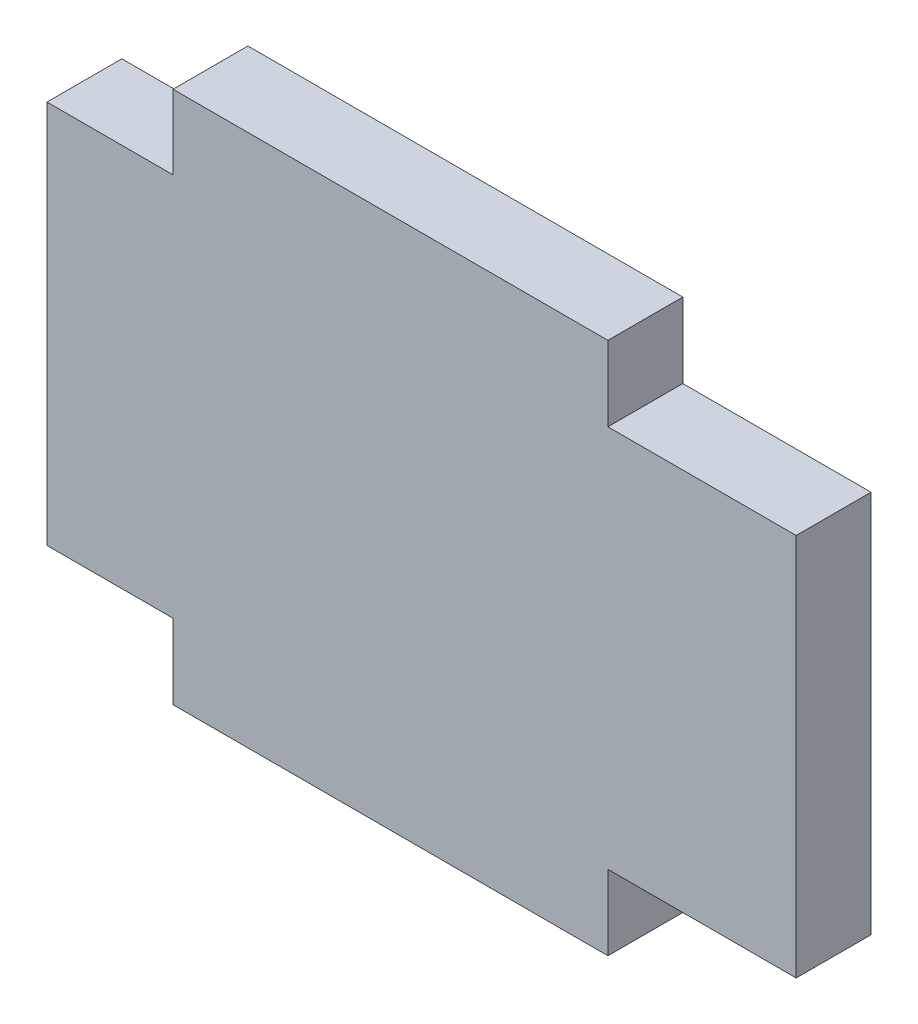
ISO-10303-21;
HEADER;
FILE_DESCRIPTION(('STEP AP214'),'2;1');
FILE_NAME('part.step','',(''),(''),'','','');
FILE_SCHEMA(('AUTOMOTIVE_DESIGN { 1 0 10303 214 1 1 1 1 }'));
ENDSEC;
DATA;
#1=APPLICATION_CONTEXT('core data for automotive mechanical design processes');
#2=APPLICATION_PROTOCOL_DEFINITION('international standard','automotive_design',2000,#1);
#3=PRODUCT_CONTEXT('',#1,'mechanical');
#4=PRODUCT('Part','Part','',(#3));
#5=PRODUCT_RELATED_PRODUCT_CATEGORY('part','',(#4));
#6=PRODUCT_DEFINITION_FORMATION('','',#4);
#7=PRODUCT_DEFINITION_CONTEXT('part definition',#1,'design');
#8=PRODUCT_DEFINITION('design','',#6,#7);
#9=PRODUCT_DEFINITION_SHAPE('','',#8);
#10=(LENGTH_UNIT() NAMED_UNIT(*) SI_UNIT(.MILLI.,.METRE.));
#11=(NAMED_UNIT(*) PLANE_ANGLE_UNIT() SI_UNIT($,.RADIAN.));
#12=(NAMED_UNIT(*) SI_UNIT($,.STERADIAN.) SOLID_ANGLE_UNIT());
#13=UNCERTAINTY_MEASURE_WITH_UNIT(LENGTH_MEASURE(1.E-05),#10,'distance_accuracy_value','');
#14=(GEOMETRIC_REPRESENTATION_CONTEXT(3) GLOBAL_UNCERTAINTY_ASSIGNED_CONTEXT((#13)) GLOBAL_UNIT_ASSIGNED_CONTEXT((#10,
#11,#12)) REPRESENTATION_CONTEXT('',''));
#15=CARTESIAN_POINT('',(0.,0.,0.));
#16=DIRECTION('',(0.,0.,1.));
#17=DIRECTION('',(1.,0.,0.));
#18=AXIS2_PLACEMENT_3D('',#15,#16,#17);
#19=CARTESIAN_POINT('',(-58.1903577759374,-25.7868973944509,5.08));
#20=DIRECTION('',(-1.,0.,0.));
#21=DIRECTION('',(0.,0.,1.));
#22=AXIS2_PLACEMENT_3D('',#19,#20,#21);
#23=PLANE('',#22);
#24=DIRECTION('',(0.,1.,0.));
#25=VECTOR('',#24,1.);
#26=CARTESIAN_POINT('',(-58.1903577759374,-25.7868973944509,0.));
#27=LINE('',#26,#25);
#28=CARTESIAN_POINT('',(-58.1903577759374,-25.7868973944509,0.));
#29=VERTEX_POINT('',#28);
#30=CARTESIAN_POINT('',(-58.1903577759374,-20.7068973944509,0.));
#31=VERTEX_POINT('',#30);
#32=EDGE_CURVE('E154',#29,#31,#27,.T.);
#33=ORIENTED_EDGE('',*,*,#32,.T.);
#34=DIRECTION('',(0.,0.,-1.));
#35=VECTOR('',#34,1.);
#36=CARTESIAN_POINT('',(-58.1903577759374,-20.7068973944509,5.08));
#37=LINE('',#36,#35);
#38=CARTESIAN_POINT('',(-58.1903577759374,-20.7068973944509,5.08));
#39=VERTEX_POINT('',#38);
#40=EDGE_CURVE('E11',#39,#31,#37,.T.);
#41=ORIENTED_EDGE('',*,*,#40,.F.);
#42=DIRECTION('',(0.,1.,0.));
#43=VECTOR('',#42,1.);
#44=CARTESIAN_POINT('',(-58.1903577759374,-25.7868973944509,5.08));
#45=LINE('',#44,#43);
#46=CARTESIAN_POINT('',(-58.1903577759374,-25.7868973944509,5.08));
#47=VERTEX_POINT('',#46);
#48=EDGE_CURVE('E178',#47,#39,#45,.T.);
#49=ORIENTED_EDGE('',*,*,#48,.F.);
#50=DIRECTION('',(0.,0.,-1.));
#51=VECTOR('',#50,1.);
#52=CARTESIAN_POINT('',(-58.1903577759374,-25.7868973944509,5.08));
#53=LINE('',#52,#51);
#54=EDGE_CURVE('E49',#47,#29,#53,.T.);
#55=ORIENTED_EDGE('',*,*,#54,.T.);
#56=EDGE_LOOP('',(#33,#41,#49,#55));
#57=FACE_BOUND('',#56,.T.);
#58=ADVANCED_FACE('F33',(#57),#23,.F.);
#59=CARTESIAN_POINT('',(-58.1903577759374,-20.7068973944509,5.08));
#60=DIRECTION('',(0.,-1.,0.));
#61=DIRECTION('',(0.,0.,-1.));
#62=AXIS2_PLACEMENT_3D('',#59,#60,#61);
#63=PLANE('',#62);
#64=DIRECTION('',(-1.,0.,0.));
#65=VECTOR('',#64,1.);
#66=CARTESIAN_POINT('',(-58.1903577759374,-20.7068973944509,0.));
#67=LINE('',#66,#65);
#68=CARTESIAN_POINT('',(-87.6935931158109,-20.7068973944509,0.));
#69=VERTEX_POINT('',#68);
#70=EDGE_CURVE('E156',#31,#69,#67,.T.);
#71=ORIENTED_EDGE('',*,*,#70,.T.);
#72=DIRECTION('',(0.,0.,-1.));
#73=VECTOR('',#72,1.);
#74=CARTESIAN_POINT('',(-87.6935931158109,-20.7068973944509,5.08));
#75=LINE('',#74,#73);
#76=CARTESIAN_POINT('',(-87.6935931158109,-20.7068973944509,5.08));
#77=VERTEX_POINT('',#76);
#78=EDGE_CURVE('E41',#77,#69,#75,.T.);
#79=ORIENTED_EDGE('',*,*,#78,.F.);
#80=DIRECTION('',(-1.,0.,0.));
#81=VECTOR('',#80,1.);
#82=CARTESIAN_POINT('',(-58.1903577759374,-20.7068973944509,5.08));
#83=LINE('',#82,#81);
#84=EDGE_CURVE('E100',#39,#77,#83,.T.);
#85=ORIENTED_EDGE('',*,*,#84,.F.);
#86=ORIENTED_EDGE('',*,*,#40,.T.);
#87=EDGE_LOOP('',(#71,#79,#85,#86));
#88=FACE_BOUND('',#87,.T.);
#89=ADVANCED_FACE('F252',(#88),#63,.F.);
#90=CARTESIAN_POINT('',(-87.6935931158109,-20.7068973944509,5.08));
#91=DIRECTION('',(1.,0.,0.));
#92=DIRECTION('',(0.,0.,-1.));
#93=AXIS2_PLACEMENT_3D('',#90,#91,#92);
#94=PLANE('',#93);
#95=DIRECTION('',(0.,-1.,0.));
#96=VECTOR('',#95,1.);
#97=CARTESIAN_POINT('',(-87.6935931158109,-20.7068973944509,0.));
#98=LINE('',#97,#96);
#99=CARTESIAN_POINT('',(-87.6935931158109,-25.7356856367035,0.));
#100=VERTEX_POINT('',#99);
#101=EDGE_CURVE('E158',#69,#100,#98,.T.);
#102=ORIENTED_EDGE('',*,*,#101,.T.);
#103=DIRECTION('',(0.,0.,-1.));
#104=VECTOR('',#103,1.);
#105=CARTESIAN_POINT('',(-87.6935931158109,-25.7356856367035,5.08));
#106=LINE('',#105,#104);
#107=CARTESIAN_POINT('',(-87.6935931158109,-25.7356856367035,5.08));
#108=VERTEX_POINT('',#107);
#109=EDGE_CURVE('E197',#108,#100,#106,.T.);
#110=ORIENTED_EDGE('',*,*,#109,.F.);
#111=DIRECTION('',(0.,-1.,0.));
#112=VECTOR('',#111,1.);
#113=CARTESIAN_POINT('',(-87.6935931158109,-20.7068973944509,5.08));
#114=LINE('',#113,#112);
#115=EDGE_CURVE('E205',#77,#108,#114,.T.);
#116=ORIENTED_EDGE('',*,*,#115,.F.);
#117=ORIENTED_EDGE('',*,*,#78,.T.);
#118=EDGE_LOOP('',(#102,#110,#116,#117));
#119=FACE_BOUND('',#118,.T.);
#120=ADVANCED_FACE('F203',(#119),#94,.F.);
#121=CARTESIAN_POINT('',(-87.6935931158109,-25.7356856367035,5.08));
#122=DIRECTION('',(0.,-1.,0.));
#123=DIRECTION('',(0.,0.,-1.));
#124=AXIS2_PLACEMENT_3D('',#121,#122,#123);
#125=PLANE('',#124);
#126=DIRECTION('',(-1.,0.,0.));
#127=VECTOR('',#126,1.);
#128=CARTESIAN_POINT('',(-87.6935931158109,-25.7356856367035,0.));
#129=LINE('',#128,#127);
#130=CARTESIAN_POINT('',(-96.2463608529397,-25.7356856367035,0.));
#131=VERTEX_POINT('',#130);
#132=EDGE_CURVE('E160',#100,#131,#129,.T.);
#133=ORIENTED_EDGE('',*,*,#132,.T.);
#134=DIRECTION('',(0.,0.,-1.));
#135=VECTOR('',#134,1.);
#136=CARTESIAN_POINT('',(-96.2463608529397,-25.7356856367035,5.08));
#137=LINE('',#136,#135);
#138=CARTESIAN_POINT('',(-96.2463608529397,-25.7356856367035,5.08));
#139=VERTEX_POINT('',#138);
#140=EDGE_CURVE('E194',#139,#131,#137,.T.);
#141=ORIENTED_EDGE('',*,*,#140,.F.);
#142=DIRECTION('',(-1.,0.,0.));
#143=VECTOR('',#142,1.);
#144=CARTESIAN_POINT('',(-87.6935931158109,-25.7356856367035,5.08));
#145=LINE('',#144,#143);
#146=EDGE_CURVE('E222',#108,#139,#145,.T.);
#147=ORIENTED_EDGE('',*,*,#146,.F.);
#148=ORIENTED_EDGE('',*,*,#109,.T.);
#149=EDGE_LOOP('',(#133,#141,#147,#148));
#150=FACE_BOUND('',#149,.T.);
#151=ADVANCED_FACE('F213',(#150),#125,.F.);
#152=CARTESIAN_POINT('',(-96.2463608529397,-25.7356856367035,5.08));
#153=DIRECTION('',(1.,0.,0.));
#154=DIRECTION('',(0.,0.,-1.));
#155=AXIS2_PLACEMENT_3D('',#152,#153,#154);
#156=PLANE('',#155);
#157=DIRECTION('',(0.,-1.,0.));
#158=VECTOR('',#157,1.);
#159=CARTESIAN_POINT('',(-96.2463608529397,-25.7356856367035,0.));
#160=LINE('',#159,#158);
#161=CARTESIAN_POINT('',(-96.2463608529397,-51.7868973944509,0.));
#162=VERTEX_POINT('',#161);
#163=EDGE_CURVE('E162',#131,#162,#160,.T.);
#164=ORIENTED_EDGE('',*,*,#163,.T.);
#165=DIRECTION('',(0.,0.,-1.));
#166=VECTOR('',#165,1.);
#167=CARTESIAN_POINT('',(-96.2463608529397,-51.7868973944509,5.08));
#168=LINE('',#167,#166);
#169=CARTESIAN_POINT('',(-96.2463608529397,-51.7868973944509,5.08));
#170=VERTEX_POINT('',#169);
#171=EDGE_CURVE('E191',#170,#162,#168,.T.);
#172=ORIENTED_EDGE('',*,*,#171,.F.);
#173=DIRECTION('',(0.,-1.,0.));
#174=VECTOR('',#173,1.);
#175=CARTESIAN_POINT('',(-96.2463608529397,-25.7356856367035,5.08));
#176=LINE('',#175,#174);
#177=EDGE_CURVE('E219',#139,#170,#176,.T.);
#178=ORIENTED_EDGE('',*,*,#177,.F.);
#179=ORIENTED_EDGE('',*,*,#140,.T.);
#180=EDGE_LOOP('',(#164,#172,#178,#179));
#181=FACE_BOUND('',#180,.T.);
#182=ADVANCED_FACE('F217',(#181),#156,.F.);
#183=CARTESIAN_POINT('',(-96.2463608529397,-51.7868973944509,5.08));
#184=DIRECTION('',(0.,1.,0.));
#185=DIRECTION('',(0.,0.,1.));
#186=AXIS2_PLACEMENT_3D('',#183,#184,#185);
#187=PLANE('',#186);
#188=DIRECTION('',(1.,0.,0.));
#189=VECTOR('',#188,1.);
#190=CARTESIAN_POINT('',(-96.2463608529397,-51.7868973944509,0.));
#191=LINE('',#190,#189);
#192=CARTESIAN_POINT('',(-87.694480523383,-51.7868973944509,0.));
#193=VERTEX_POINT('',#192);
#194=EDGE_CURVE('E164',#162,#193,#191,.T.);
#195=ORIENTED_EDGE('',*,*,#194,.T.);
#196=DIRECTION('',(0.,0.,-1.));
#197=VECTOR('',#196,1.);
#198=CARTESIAN_POINT('',(-87.694480523383,-51.7868973944509,5.08));
#199=LINE('',#198,#197);
#200=CARTESIAN_POINT('',(-87.694480523383,-51.7868973944509,5.08));
#201=VERTEX_POINT('',#200);
#202=EDGE_CURVE('E188',#201,#193,#199,.T.);
#203=ORIENTED_EDGE('',*,*,#202,.F.);
#204=DIRECTION('',(1.,0.,0.));
#205=VECTOR('',#204,1.);
#206=CARTESIAN_POINT('',(-96.2463608529397,-51.7868973944509,5.08));
#207=LINE('',#206,#205);
#208=EDGE_CURVE('E221',#170,#201,#207,.T.);
#209=ORIENTED_EDGE('',*,*,#208,.F.);
#210=ORIENTED_EDGE('',*,*,#171,.T.);
#211=EDGE_LOOP('',(#195,#203,#209,#210));
#212=FACE_BOUND('',#211,.T.);
#213=ADVANCED_FACE('F268',(#212),#187,.F.);
#214=CARTESIAN_POINT('',(-87.694480523383,-51.7868973944509,5.08));
#215=DIRECTION('',(1.,0.,0.));
#216=DIRECTION('',(0.,0.,-1.));
#217=AXIS2_PLACEMENT_3D('',#214,#215,#216);
#218=PLANE('',#217);
#219=DIRECTION('',(0.,-1.,0.));
#220=VECTOR('',#219,1.);
#221=CARTESIAN_POINT('',(-87.694480523383,-51.7868973944509,0.));
#222=LINE('',#221,#220);
#223=CARTESIAN_POINT('',(-87.694480523383,-56.8668973944509,0.));
#224=VERTEX_POINT('',#223);
#225=EDGE_CURVE('E166',#193,#224,#222,.T.);
#226=ORIENTED_EDGE('',*,*,#225,.T.);
#227=DIRECTION('',(0.,0.,-1.));
#228=VECTOR('',#227,1.);
#229=CARTESIAN_POINT('',(-87.694480523383,-56.8668973944509,5.08));
#230=LINE('',#229,#228);
#231=CARTESIAN_POINT('',(-87.694480523383,-56.8668973944509,5.08));
#232=VERTEX_POINT('',#231);
#233=EDGE_CURVE('E185',#232,#224,#230,.T.);
#234=ORIENTED_EDGE('',*,*,#233,.F.);
#235=DIRECTION('',(0.,-1.,0.));
#236=VECTOR('',#235,1.);
#237=CARTESIAN_POINT('',(-87.694480523383,-51.7868973944509,5.08));
#238=LINE('',#237,#236);
#239=EDGE_CURVE('E224',#201,#232,#238,.T.);
#240=ORIENTED_EDGE('',*,*,#239,.F.);
#241=ORIENTED_EDGE('',*,*,#202,.T.);
#242=EDGE_LOOP('',(#226,#234,#240,#241));
#243=FACE_BOUND('',#242,.T.);
#244=ADVANCED_FACE('F271',(#243),#218,.F.);
#245=CARTESIAN_POINT('',(-87.694480523383,-56.8668973944509,5.08));
#246=DIRECTION('',(0.,1.,0.));
#247=DIRECTION('',(0.,0.,1.));
#248=AXIS2_PLACEMENT_3D('',#245,#246,#247);
#249=PLANE('',#248);
#250=DIRECTION('',(1.,0.,0.));
#251=VECTOR('',#250,1.);
#252=CARTESIAN_POINT('',(-87.694480523383,-56.8668973944509,0.));
#253=LINE('',#252,#251);
#254=CARTESIAN_POINT('',(-58.1912451835094,-56.8668973944509,0.));
#255=VERTEX_POINT('',#254);
#256=EDGE_CURVE('E168',#224,#255,#253,.T.);
#257=ORIENTED_EDGE('',*,*,#256,.T.);
#258=DIRECTION('',(0.,0.,-1.));
#259=VECTOR('',#258,1.);
#260=CARTESIAN_POINT('',(-58.1912451835094,-56.8668973944509,5.08));
#261=LINE('',#260,#259);
#262=CARTESIAN_POINT('',(-58.1912451835094,-56.8668973944509,5.08));
#263=VERTEX_POINT('',#262);
#264=EDGE_CURVE('E182',#263,#255,#261,.T.);
#265=ORIENTED_EDGE('',*,*,#264,.F.);
#266=DIRECTION('',(1.,0.,0.));
#267=VECTOR('',#266,1.);
#268=CARTESIAN_POINT('',(-87.694480523383,-56.8668973944509,5.08));
#269=LINE('',#268,#267);
#270=EDGE_CURVE('E230',#232,#263,#269,.T.);
#271=ORIENTED_EDGE('',*,*,#270,.F.);
#272=ORIENTED_EDGE('',*,*,#233,.T.);
#273=EDGE_LOOP('',(#257,#265,#271,#272));
#274=FACE_BOUND('',#273,.T.);
#275=ADVANCED_FACE('F236',(#274),#249,.F.);
#276=CARTESIAN_POINT('',(-58.1912451835094,-56.8668973944509,5.08));
#277=DIRECTION('',(-1.,0.,0.));
#278=DIRECTION('',(0.,0.,1.));
#279=AXIS2_PLACEMENT_3D('',#276,#277,#278);
#280=PLANE('',#279);
#281=DIRECTION('',(0.,1.,0.));
#282=VECTOR('',#281,1.);
#283=CARTESIAN_POINT('',(-58.1912451835094,-56.8668973944509,0.));
#284=LINE('',#283,#282);
#285=CARTESIAN_POINT('',(-58.1912451835094,-51.7868973944503,0.));
#286=VERTEX_POINT('',#285);
#287=EDGE_CURVE('E170',#255,#286,#284,.T.);
#288=ORIENTED_EDGE('',*,*,#287,.T.);
#289=DIRECTION('',(0.,0.,-1.));
#290=VECTOR('',#289,1.);
#291=CARTESIAN_POINT('',(-58.1912451835094,-51.7868973944503,5.08));
#292=LINE('',#291,#290);
#293=CARTESIAN_POINT('',(-58.1912451835094,-51.7868973944503,5.08));
#294=VERTEX_POINT('',#293);
#295=EDGE_CURVE('E146',#294,#286,#292,.T.);
#296=ORIENTED_EDGE('',*,*,#295,.F.);
#297=DIRECTION('',(0.,1.,0.));
#298=VECTOR('',#297,1.);
#299=CARTESIAN_POINT('',(-58.1912451835094,-56.8668973944509,5.08));
#300=LINE('',#299,#298);
#301=EDGE_CURVE('E134',#263,#294,#300,.T.);
#302=ORIENTED_EDGE('',*,*,#301,.F.);
#303=ORIENTED_EDGE('',*,*,#264,.T.);
#304=EDGE_LOOP('',(#288,#296,#302,#303));
#305=FACE_BOUND('',#304,.T.);
#306=ADVANCED_FACE('F240',(#305),#280,.F.);
#307=CARTESIAN_POINT('',(-58.1912451835094,-51.7868973944503,5.08));
#308=DIRECTION('',(0.,1.,0.));
#309=DIRECTION('',(0.,0.,1.));
#310=AXIS2_PLACEMENT_3D('',#307,#308,#309);
#311=PLANE('',#310);
#312=DIRECTION('',(1.,0.,0.));
#313=VECTOR('',#312,1.);
#314=CARTESIAN_POINT('',(-58.1912451835094,-51.7868973944503,0.));
#315=LINE('',#314,#313);
#316=CARTESIAN_POINT('',(-45.4193775711541,-51.7868973944503,0.));
#317=VERTEX_POINT('',#316);
#318=EDGE_CURVE('E143',#286,#317,#315,.T.);
#319=ORIENTED_EDGE('',*,*,#318,.T.);
#320=DIRECTION('',(0.,0.,-1.));
#321=VECTOR('',#320,1.);
#322=CARTESIAN_POINT('',(-45.4193775711541,-51.7868973944503,5.08));
#323=LINE('',#322,#321);
#324=CARTESIAN_POINT('',(-45.4193775711541,-51.7868973944503,5.08));
#325=VERTEX_POINT('',#324);
#326=EDGE_CURVE('E140',#325,#317,#323,.T.);
#327=ORIENTED_EDGE('',*,*,#326,.F.);
#328=DIRECTION('',(1.,0.,0.));
#329=VECTOR('',#328,1.);
#330=CARTESIAN_POINT('',(-58.1912451835094,-51.7868973944503,5.08));
#331=LINE('',#330,#329);
#332=EDGE_CURVE('E127',#294,#325,#331,.T.);
#333=ORIENTED_EDGE('',*,*,#332,.F.);
#334=ORIENTED_EDGE('',*,*,#295,.T.);
#335=EDGE_LOOP('',(#319,#327,#333,#334));
#336=FACE_BOUND('',#335,.T.);
#337=ADVANCED_FACE('F141',(#336),#311,.F.);
#338=CARTESIAN_POINT('',(-45.4193775711541,-51.7868973944503,5.08));
#339=DIRECTION('',(-1.,0.,0.));
#340=DIRECTION('',(0.,0.,1.));
#341=AXIS2_PLACEMENT_3D('',#338,#339,#340);
#342=PLANE('',#341);
#343=DIRECTION('',(0.,1.,0.));
#344=VECTOR('',#343,1.);
#345=CARTESIAN_POINT('',(-45.4193775711541,-51.7868973944503,0.));
#346=LINE('',#345,#344);
#347=CARTESIAN_POINT('',(-45.4193775711541,-25.7868973944509,0.));
#348=VERTEX_POINT('',#347);
#349=EDGE_CURVE('E173',#317,#348,#346,.T.);
#350=ORIENTED_EDGE('',*,*,#349,.T.);
#351=DIRECTION('',(0.,0.,-1.));
#352=VECTOR('',#351,1.);
#353=CARTESIAN_POINT('',(-45.4193775711541,-25.7868973944509,5.08));
#354=LINE('',#353,#352);
#355=CARTESIAN_POINT('',(-45.4193775711541,-25.7868973944509,5.08));
#356=VERTEX_POINT('',#355);
#357=EDGE_CURVE('E88',#356,#348,#354,.T.);
#358=ORIENTED_EDGE('',*,*,#357,.F.);
#359=DIRECTION('',(0.,1.,0.));
#360=VECTOR('',#359,1.);
#361=CARTESIAN_POINT('',(-45.4193775711541,-51.7868973944503,5.08));
#362=LINE('',#361,#360);
#363=EDGE_CURVE('E132',#325,#356,#362,.T.);
#364=ORIENTED_EDGE('',*,*,#363,.F.);
#365=ORIENTED_EDGE('',*,*,#326,.T.);
#366=EDGE_LOOP('',(#350,#358,#364,#365));
#367=FACE_BOUND('',#366,.T.);
#368=ADVANCED_FACE('F148',(#367),#342,.F.);
#369=CARTESIAN_POINT('',(-58.1903577759374,-25.7868973944509,5.08));
#370=DIRECTION('',(0.,1.,0.));
#371=DIRECTION('',(-1.,0.,0.));
#372=AXIS2_PLACEMENT_3D('',#369,#370,#371);
#373=PLANE('',#372);
#374=DIRECTION('',(1.,0.,0.));
#375=VECTOR('',#374,1.);
#376=CARTESIAN_POINT('',(-58.1903577759374,-25.7868973944509,0.));
#377=LINE('',#376,#375);
#378=EDGE_CURVE('E175',#29,#348,#377,.T.);
#379=ORIENTED_EDGE('',*,*,#378,.F.);
#380=ORIENTED_EDGE('',*,*,#54,.F.);
#381=DIRECTION('',(1.,0.,0.));
#382=VECTOR('',#381,1.);
#383=CARTESIAN_POINT('',(-58.1903577759374,-25.7868973944509,5.08));
#384=LINE('',#383,#382);
#385=EDGE_CURVE('E149',#47,#356,#384,.T.);
#386=ORIENTED_EDGE('',*,*,#385,.T.);
#387=ORIENTED_EDGE('',*,*,#357,.T.);
#388=EDGE_LOOP('',(#379,#380,#386,#387));
#389=FACE_BOUND('',#388,.T.);
#390=ADVANCED_FACE('F241',(#389),#373,.T.);
#391=CARTESIAN_POINT('',(0.,0.,5.08));
#392=DIRECTION('',(0.,0.,1.));
#393=DIRECTION('',(1.,0.,0.));
#394=AXIS2_PLACEMENT_3D('',#391,#392,#393);
#395=PLANE('',#394);
#396=ORIENTED_EDGE('',*,*,#48,.T.);
#397=ORIENTED_EDGE('',*,*,#84,.T.);
#398=ORIENTED_EDGE('',*,*,#115,.T.);
#399=ORIENTED_EDGE('',*,*,#146,.T.);
#400=ORIENTED_EDGE('',*,*,#177,.T.);
#401=ORIENTED_EDGE('',*,*,#208,.T.);
#402=ORIENTED_EDGE('',*,*,#239,.T.);
#403=ORIENTED_EDGE('',*,*,#270,.T.);
#404=ORIENTED_EDGE('',*,*,#301,.T.);
#405=ORIENTED_EDGE('',*,*,#332,.T.);
#406=ORIENTED_EDGE('',*,*,#363,.T.);
#407=ORIENTED_EDGE('',*,*,#385,.F.);
#408=EDGE_LOOP('',(#396,#397,#398,#399,#400,#401,#402,#403,#404,#405,#406,#407));
#409=FACE_BOUND('',#408,.T.);
#410=ADVANCED_FACE('F129',(#409),#395,.T.);
#411=CARTESIAN_POINT('',(0.,0.,0.));
#412=DIRECTION('',(0.,0.,1.));
#413=DIRECTION('',(1.,0.,0.));
#414=AXIS2_PLACEMENT_3D('',#411,#412,#413);
#415=PLANE('',#414);
#416=ORIENTED_EDGE('',*,*,#32,.F.);
#417=ORIENTED_EDGE('',*,*,#378,.T.);
#418=ORIENTED_EDGE('',*,*,#349,.F.);
#419=ORIENTED_EDGE('',*,*,#318,.F.);
#420=ORIENTED_EDGE('',*,*,#287,.F.);
#421=ORIENTED_EDGE('',*,*,#256,.F.);
#422=ORIENTED_EDGE('',*,*,#225,.F.);
#423=ORIENTED_EDGE('',*,*,#194,.F.);
#424=ORIENTED_EDGE('',*,*,#163,.F.);
#425=ORIENTED_EDGE('',*,*,#132,.F.);
#426=ORIENTED_EDGE('',*,*,#101,.F.);
#427=ORIENTED_EDGE('',*,*,#70,.F.);
#428=EDGE_LOOP('',(#416,#417,#418,#419,#420,#421,#422,#423,#424,#425,#426,#427));
#429=FACE_BOUND('',#428,.T.);
#430=ADVANCED_FACE('F208',(#429),#415,.F.);
#431=CLOSED_SHELL('',(#58,#89,#120,#151,#182,#213,#244,#275,#306,#337,#368,#390,#410,#430));
#432=MANIFOLD_SOLID_BREP('B2',#431);
#433=ADVANCED_BREP_SHAPE_REPRESENTATION('',(#18,#432),#14);
#434=SHAPE_DEFINITION_REPRESENTATION(#9,#433);
ENDSEC;
END-ISO-10303-21;
